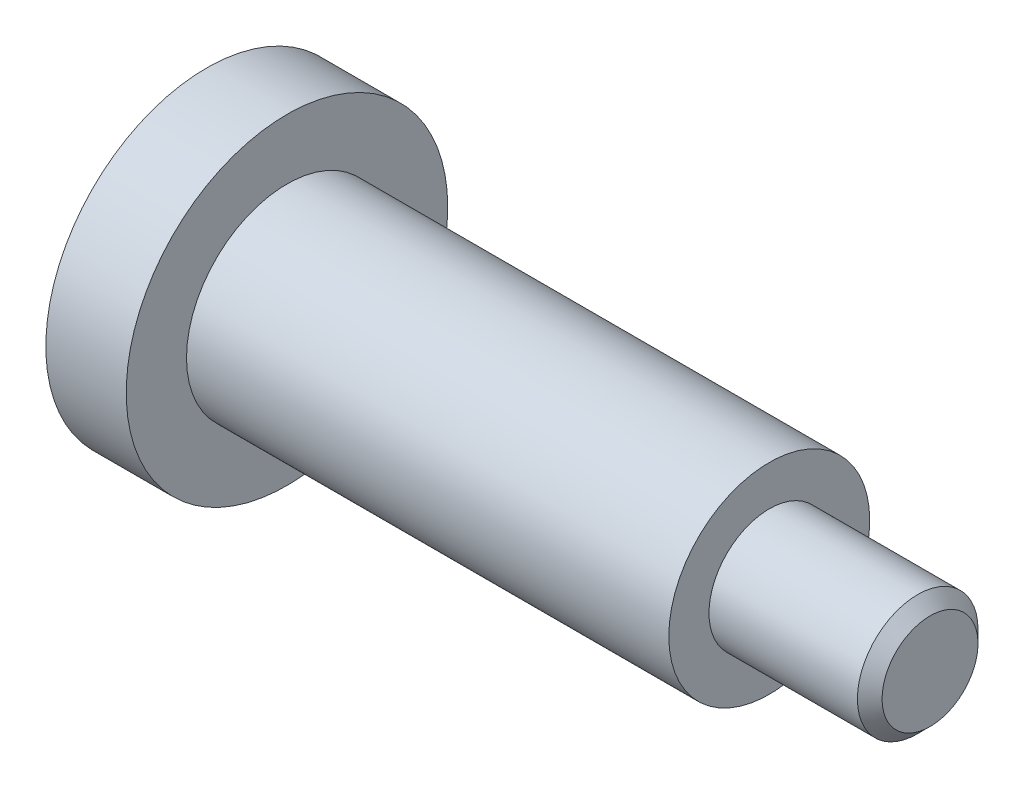
ISO-10303-21;
HEADER;
FILE_DESCRIPTION(('STEP AP214'),'2;1');
FILE_NAME('part.step','',(''),(''),'','','');
FILE_SCHEMA(('AUTOMOTIVE_DESIGN { 1 0 10303 214 1 1 1 1 }'));
ENDSEC;
DATA;
#1=APPLICATION_CONTEXT('core data for automotive mechanical design processes');
#2=APPLICATION_PROTOCOL_DEFINITION('international standard','automotive_design',2000,#1);
#3=PRODUCT_CONTEXT('',#1,'mechanical');
#4=PRODUCT('Part','Part','',(#3));
#5=PRODUCT_RELATED_PRODUCT_CATEGORY('part','',(#4));
#6=PRODUCT_DEFINITION_FORMATION('','',#4);
#7=PRODUCT_DEFINITION_CONTEXT('part definition',#1,'design');
#8=PRODUCT_DEFINITION('design','',#6,#7);
#9=PRODUCT_DEFINITION_SHAPE('','',#8);
#10=(LENGTH_UNIT() NAMED_UNIT(*) SI_UNIT(.MILLI.,.METRE.));
#11=(NAMED_UNIT(*) PLANE_ANGLE_UNIT() SI_UNIT($,.RADIAN.));
#12=(NAMED_UNIT(*) SI_UNIT($,.STERADIAN.) SOLID_ANGLE_UNIT());
#13=UNCERTAINTY_MEASURE_WITH_UNIT(LENGTH_MEASURE(1.E-05),#10,'distance_accuracy_value','');
#14=(GEOMETRIC_REPRESENTATION_CONTEXT(3) GLOBAL_UNCERTAINTY_ASSIGNED_CONTEXT((#13)) GLOBAL_UNIT_ASSIGNED_CONTEXT((#10,
#11,#12)) REPRESENTATION_CONTEXT('',''));
#15=CARTESIAN_POINT('',(0.,0.,0.));
#16=DIRECTION('',(0.,0.,1.));
#17=DIRECTION('',(1.,0.,0.));
#18=AXIS2_PLACEMENT_3D('',#15,#16,#17);
#19=CARTESIAN_POINT('',(0.,0.,0.));
#20=DIRECTION('',(1.,0.,0.));
#21=DIRECTION('',(0.,0.,-1.));
#22=AXIS2_PLACEMENT_3D('',#19,#20,#21);
#23=PLANE('',#22);
#24=DIRECTION('',(0.,0.5,-0.866025403784439));
#25=VECTOR('',#24,1.);
#26=CARTESIAN_POINT('',(0.,-0.577350269189626,-1.));
#27=LINE('',#26,#25);
#28=CARTESIAN_POINT('',(-2.8421275749535E-11,-0.866025403798813,-0.500000000008299));
#29=VERTEX_POINT('',#28);
#30=CARTESIAN_POINT('',(0.,-1.15470053837925,0.));
#31=VERTEX_POINT('',#30);
#32=EDGE_CURVE('E133',#29,#31,#27,.F.);
#33=ORIENTED_EDGE('',*,*,#32,.T.);
#34=DIRECTION('',(0.,-0.5,-0.866025403784439));
#35=VECTOR('',#34,1.);
#36=CARTESIAN_POINT('',(0.,-1.15470053837925,0.));
#37=LINE('',#36,#35);
#38=CARTESIAN_POINT('',(-2.8421275749535E-11,-0.866025403798813,0.500000000008298));
#39=VERTEX_POINT('',#38);
#40=EDGE_CURVE('E138',#31,#39,#37,.F.);
#41=ORIENTED_EDGE('',*,*,#40,.T.);
#42=CARTESIAN_POINT('',(-5.6843418860808E-11,0.,0.));
#43=DIRECTION('',(-1.,0.,0.));
#44=DIRECTION('',(0.,0.,1.));
#45=AXIS2_PLACEMENT_3D('',#42,#43,#44);
#46=CIRCLE('',#45,1.0000000000332);
#47=EDGE_CURVE('E109',#39,#29,#46,.F.);
#48=ORIENTED_EDGE('',*,*,#47,.T.);
#49=EDGE_LOOP('',(#33,#41,#48));
#50=FACE_BOUND('',#49,.T.);
#51=ADVANCED_FACE('F16',(#50),#23,.F.);
#52=CARTESIAN_POINT('',(0.,0.,0.));
#53=DIRECTION('',(1.,0.,0.));
#54=DIRECTION('',(0.,0.,-1.));
#55=AXIS2_PLACEMENT_3D('',#52,#53,#54);
#56=PLANE('',#55);
#57=DIRECTION('',(0.,1.,0.));
#58=VECTOR('',#57,1.);
#59=CARTESIAN_POINT('',(0.,0.577350269189626,-1.));
#60=LINE('',#59,#58);
#61=CARTESIAN_POINT('',(-2.8421709430404E-11,0.,-1.0000000000166));
#62=VERTEX_POINT('',#61);
#63=CARTESIAN_POINT('',(0.,-0.577350269189626,-1.));
#64=VERTEX_POINT('',#63);
#65=EDGE_CURVE('E90',#62,#64,#60,.F.);
#66=ORIENTED_EDGE('',*,*,#65,.T.);
#67=DIRECTION('',(0.,0.5,-0.866025403784439));
#68=VECTOR('',#67,1.);
#69=CARTESIAN_POINT('',(0.,-0.577350269189626,-1.));
#70=LINE('',#69,#68);
#71=EDGE_CURVE('E92',#64,#29,#70,.F.);
#72=ORIENTED_EDGE('',*,*,#71,.T.);
#73=CARTESIAN_POINT('',(-5.6843418860808E-11,0.,0.));
#74=DIRECTION('',(-1.,0.,0.));
#75=DIRECTION('',(0.,0.,1.));
#76=AXIS2_PLACEMENT_3D('',#73,#74,#75);
#77=CIRCLE('',#76,1.0000000000332);
#78=EDGE_CURVE('E19',#29,#62,#77,.F.);
#79=ORIENTED_EDGE('',*,*,#78,.T.);
#80=EDGE_LOOP('',(#66,#72,#79));
#81=FACE_BOUND('',#80,.T.);
#82=ADVANCED_FACE('F88',(#81),#56,.F.);
#83=CARTESIAN_POINT('',(-2.,-0.577350269189626,-1.));
#84=DIRECTION('',(0.,-0.866025403784439,-0.5));
#85=DIRECTION('',(0.,0.5,-0.866025403784439));
#86=AXIS2_PLACEMENT_3D('',#83,#84,#85);
#87=PLANE('',#86);
#88=DIRECTION('',(1.,0.,0.));
#89=VECTOR('',#88,1.);
#90=CARTESIAN_POINT('',(-2.,-1.15470053837925,0.));
#91=LINE('',#90,#89);
#92=CARTESIAN_POINT('',(-2.,-1.15470053837925,0.));
#93=VERTEX_POINT('',#92);
#94=EDGE_CURVE('E141',#93,#31,#91,.T.);
#95=ORIENTED_EDGE('',*,*,#94,.T.);
#96=ORIENTED_EDGE('',*,*,#32,.F.);
#97=ORIENTED_EDGE('',*,*,#71,.F.);
#98=DIRECTION('',(-1.,0.,0.));
#99=VECTOR('',#98,1.);
#100=CARTESIAN_POINT('',(-2.,-0.577350269189626,-1.));
#101=LINE('',#100,#99);
#102=CARTESIAN_POINT('',(-2.,-0.577350269189626,-1.));
#103=VERTEX_POINT('',#102);
#104=EDGE_CURVE('E122',#64,#103,#101,.T.);
#105=ORIENTED_EDGE('',*,*,#104,.T.);
#106=DIRECTION('',(0.,0.5,-0.866025403784439));
#107=VECTOR('',#106,1.);
#108=CARTESIAN_POINT('',(-2.,-0.577350269189626,-1.));
#109=LINE('',#108,#107);
#110=EDGE_CURVE('E146',#93,#103,#109,.T.);
#111=ORIENTED_EDGE('',*,*,#110,.F.);
#112=EDGE_LOOP('',(#95,#96,#97,#105,#111));
#113=FACE_BOUND('',#112,.T.);
#114=ADVANCED_FACE('F398',(#113),#87,.F.);
#115=CARTESIAN_POINT('',(-2.,-1.15470053837925,0.));
#116=DIRECTION('',(0.,-0.866025403784439,0.5));
#117=DIRECTION('',(0.,-0.5,-0.866025403784439));
#118=AXIS2_PLACEMENT_3D('',#115,#116,#117);
#119=PLANE('',#118);
#120=DIRECTION('',(1.,0.,0.));
#121=VECTOR('',#120,1.);
#122=CARTESIAN_POINT('',(-2.,-0.577350269189626,1.));
#123=LINE('',#122,#121);
#124=CARTESIAN_POINT('',(-2.,-0.577350269189626,1.));
#125=VERTEX_POINT('',#124);
#126=CARTESIAN_POINT('',(0.,-0.577350269189626,1.));
#127=VERTEX_POINT('',#126);
#128=EDGE_CURVE('E156',#125,#127,#123,.T.);
#129=ORIENTED_EDGE('',*,*,#128,.T.);
#130=DIRECTION('',(0.,-0.5,-0.866025403784439));
#131=VECTOR('',#130,1.);
#132=CARTESIAN_POINT('',(0.,-0.577350269189626,1.));
#133=LINE('',#132,#131);
#134=EDGE_CURVE('E97',#127,#39,#133,.T.);
#135=ORIENTED_EDGE('',*,*,#134,.T.);
#136=ORIENTED_EDGE('',*,*,#40,.F.);
#137=ORIENTED_EDGE('',*,*,#94,.F.);
#138=DIRECTION('',(0.,-0.5,-0.866025403784439));
#139=VECTOR('',#138,1.);
#140=CARTESIAN_POINT('',(-2.,-1.15470053837925,0.));
#141=LINE('',#140,#139);
#142=EDGE_CURVE('E140',#125,#93,#141,.T.);
#143=ORIENTED_EDGE('',*,*,#142,.F.);
#144=EDGE_LOOP('',(#129,#135,#136,#137,#143));
#145=FACE_BOUND('',#144,.T.);
#146=ADVANCED_FACE('F196',(#145),#119,.F.);
#147=CARTESIAN_POINT('',(0.,0.,0.));
#148=DIRECTION('',(1.,0.,0.));
#149=DIRECTION('',(0.,0.,-1.));
#150=AXIS2_PLACEMENT_3D('',#147,#148,#149);
#151=PLANE('',#150);
#152=ORIENTED_EDGE('',*,*,#134,.F.);
#153=DIRECTION('',(0.,1.,0.));
#154=VECTOR('',#153,1.);
#155=CARTESIAN_POINT('',(0.,-0.577350269189626,1.));
#156=LINE('',#155,#154);
#157=CARTESIAN_POINT('',(-2.8421709430404E-11,0.,1.0000000000166));
#158=VERTEX_POINT('',#157);
#159=EDGE_CURVE('E189',#127,#158,#156,.T.);
#160=ORIENTED_EDGE('',*,*,#159,.T.);
#161=CARTESIAN_POINT('',(-5.6843418860808E-11,0.,0.));
#162=DIRECTION('',(-1.,0.,0.));
#163=DIRECTION('',(0.,0.,1.));
#164=AXIS2_PLACEMENT_3D('',#161,#162,#163);
#165=CIRCLE('',#164,1.0000000000332);
#166=EDGE_CURVE('E96',#158,#39,#165,.F.);
#167=ORIENTED_EDGE('',*,*,#166,.T.);
#168=EDGE_LOOP('',(#152,#160,#167));
#169=FACE_BOUND('',#168,.T.);
#170=ADVANCED_FACE('F186',(#169),#151,.F.);
#171=CARTESIAN_POINT('',(-5.6843418860808E-11,0.,0.));
#172=DIRECTION('',(-1.,0.,0.));
#173=DIRECTION('',(0.,0.,1.));
#174=AXIS2_PLACEMENT_3D('',#171,#172,#173);
#175=CONICAL_SURFACE('',#174,1.0000000000332,1.04719755109258);
#176=CARTESIAN_POINT('',(-5.6843418860808E-11,0.,0.));
#177=DIRECTION('',(-1.,0.,0.));
#178=DIRECTION('',(0.,0.,1.));
#179=AXIS2_PLACEMENT_3D('',#176,#177,#178);
#180=CIRCLE('',#179,1.0000000000332);
#181=CARTESIAN_POINT('',(-2.8421275749535E-11,0.866025403798813,0.500000000008299));
#182=VERTEX_POINT('',#181);
#183=CARTESIAN_POINT('',(-2.8421275749535E-11,0.866025403798813,-0.500000000008299));
#184=VERTEX_POINT('',#183);
#185=EDGE_CURVE('E104',#182,#184,#180,.T.);
#186=ORIENTED_EDGE('',*,*,#185,.T.);
#187=CARTESIAN_POINT('',(-5.6843418860808E-11,0.,0.));
#188=DIRECTION('',(-1.,0.,0.));
#189=DIRECTION('',(0.,0.,1.));
#190=AXIS2_PLACEMENT_3D('',#187,#188,#189);
#191=CIRCLE('',#190,1.0000000000332);
#192=EDGE_CURVE('E99',#184,#62,#191,.T.);
#193=ORIENTED_EDGE('',*,*,#192,.T.);
#194=ORIENTED_EDGE('',*,*,#78,.F.);
#195=ORIENTED_EDGE('',*,*,#47,.F.);
#196=ORIENTED_EDGE('',*,*,#166,.F.);
#197=CARTESIAN_POINT('',(-5.6843418860808E-11,0.,0.));
#198=DIRECTION('',(-1.,0.,0.));
#199=DIRECTION('',(0.,0.,1.));
#200=AXIS2_PLACEMENT_3D('',#197,#198,#199);
#201=CIRCLE('',#200,1.0000000000332);
#202=EDGE_CURVE('E178',#158,#182,#201,.T.);
#203=ORIENTED_EDGE('',*,*,#202,.T.);
#204=EDGE_LOOP('',(#186,#193,#194,#195,#196,#203));
#205=FACE_BOUND('',#204,.T.);
#206=CARTESIAN_POINT('',(0.577350269196586,2.8421709430404E-11,0.));
#207=VERTEX_POINT('',#206);
#208=VERTEX_LOOP('',#207);
#209=FACE_BOUND('',#208,.T.);
#210=ADVANCED_FACE('F101',(#205,#209),#175,.F.);
#211=CARTESIAN_POINT('',(0.,0.,0.));
#212=DIRECTION('',(1.,0.,0.));
#213=DIRECTION('',(0.,0.,-1.));
#214=AXIS2_PLACEMENT_3D('',#211,#212,#213);
#215=PLANE('',#214);
#216=DIRECTION('',(0.,0.5,0.866025403784439));
#217=VECTOR('',#216,1.);
#218=CARTESIAN_POINT('',(0.,1.15470053837925,0.));
#219=LINE('',#218,#217);
#220=CARTESIAN_POINT('',(0.,0.577350269189625,-1.));
#221=VERTEX_POINT('',#220);
#222=EDGE_CURVE('E113',#184,#221,#219,.F.);
#223=ORIENTED_EDGE('',*,*,#222,.T.);
#224=DIRECTION('',(0.,1.,0.));
#225=VECTOR('',#224,1.);
#226=CARTESIAN_POINT('',(0.,0.577350269189626,-1.));
#227=LINE('',#226,#225);
#228=EDGE_CURVE('E108',#221,#62,#227,.F.);
#229=ORIENTED_EDGE('',*,*,#228,.T.);
#230=ORIENTED_EDGE('',*,*,#192,.F.);
#231=EDGE_LOOP('',(#223,#229,#230));
#232=FACE_BOUND('',#231,.T.);
#233=ADVANCED_FACE('F112',(#232),#215,.F.);
#234=CARTESIAN_POINT('',(-2.,0.577350269189626,-1.));
#235=DIRECTION('',(0.,0.,-1.));
#236=DIRECTION('',(-1.,0.,0.));
#237=AXIS2_PLACEMENT_3D('',#234,#235,#236);
#238=PLANE('',#237);
#239=ORIENTED_EDGE('',*,*,#104,.F.);
#240=ORIENTED_EDGE('',*,*,#65,.F.);
#241=ORIENTED_EDGE('',*,*,#228,.F.);
#242=DIRECTION('',(1.,0.,0.));
#243=VECTOR('',#242,1.);
#244=CARTESIAN_POINT('',(-2.,0.577350269189625,-1.));
#245=LINE('',#244,#243);
#246=CARTESIAN_POINT('',(-2.,0.577350269189626,-1.));
#247=VERTEX_POINT('',#246);
#248=EDGE_CURVE('E212',#221,#247,#245,.F.);
#249=ORIENTED_EDGE('',*,*,#248,.T.);
#250=DIRECTION('',(0.,1.,0.));
#251=VECTOR('',#250,1.);
#252=CARTESIAN_POINT('',(-2.,0.577350269189626,-1.));
#253=LINE('',#252,#251);
#254=EDGE_CURVE('E124',#103,#247,#253,.T.);
#255=ORIENTED_EDGE('',*,*,#254,.F.);
#256=EDGE_LOOP('',(#239,#240,#241,#249,#255));
#257=FACE_BOUND('',#256,.T.);
#258=ADVANCED_FACE('F119',(#257),#238,.F.);
#259=CARTESIAN_POINT('',(-2.,-0.577350269189626,1.));
#260=DIRECTION('',(0.,0.,1.));
#261=DIRECTION('',(1.,0.,0.));
#262=AXIS2_PLACEMENT_3D('',#259,#260,#261);
#263=PLANE('',#262);
#264=DIRECTION('',(1.,0.,0.));
#265=VECTOR('',#264,1.);
#266=CARTESIAN_POINT('',(-2.,0.577350269189626,1.));
#267=LINE('',#266,#265);
#268=CARTESIAN_POINT('',(-2.,0.577350269189626,1.));
#269=VERTEX_POINT('',#268);
#270=CARTESIAN_POINT('',(0.,0.577350269189626,1.));
#271=VERTEX_POINT('',#270);
#272=EDGE_CURVE('E228',#269,#271,#267,.T.);
#273=ORIENTED_EDGE('',*,*,#272,.T.);
#274=DIRECTION('',(0.,1.,0.));
#275=VECTOR('',#274,1.);
#276=CARTESIAN_POINT('',(0.,0.,1.));
#277=LINE('',#276,#275);
#278=EDGE_CURVE('E179',#271,#158,#277,.F.);
#279=ORIENTED_EDGE('',*,*,#278,.T.);
#280=ORIENTED_EDGE('',*,*,#159,.F.);
#281=ORIENTED_EDGE('',*,*,#128,.F.);
#282=DIRECTION('',(0.,1.,0.));
#283=VECTOR('',#282,1.);
#284=CARTESIAN_POINT('',(-2.,-0.577350269189626,1.));
#285=LINE('',#284,#283);
#286=EDGE_CURVE('E209',#269,#125,#285,.F.);
#287=ORIENTED_EDGE('',*,*,#286,.F.);
#288=EDGE_LOOP('',(#273,#279,#280,#281,#287));
#289=FACE_BOUND('',#288,.T.);
#290=ADVANCED_FACE('F359',(#289),#263,.F.);
#291=CARTESIAN_POINT('',(0.,0.,0.));
#292=DIRECTION('',(1.,0.,0.));
#293=DIRECTION('',(0.,0.,-1.));
#294=AXIS2_PLACEMENT_3D('',#291,#292,#293);
#295=PLANE('',#294);
#296=ORIENTED_EDGE('',*,*,#278,.F.);
#297=DIRECTION('',(0.,-0.5,0.866025403784439));
#298=VECTOR('',#297,1.);
#299=CARTESIAN_POINT('',(0.,0.577350269189626,1.));
#300=LINE('',#299,#298);
#301=EDGE_CURVE('E230',#271,#182,#300,.F.);
#302=ORIENTED_EDGE('',*,*,#301,.T.);
#303=ORIENTED_EDGE('',*,*,#202,.F.);
#304=EDGE_LOOP('',(#296,#302,#303));
#305=FACE_BOUND('',#304,.T.);
#306=ADVANCED_FACE('F351',(#305),#295,.F.);
#307=CARTESIAN_POINT('',(0.,0.,0.));
#308=DIRECTION('',(1.,0.,0.));
#309=DIRECTION('',(0.,0.,-1.));
#310=AXIS2_PLACEMENT_3D('',#307,#308,#309);
#311=PLANE('',#310);
#312=DIRECTION('',(0.,-0.5,0.866025403784439));
#313=VECTOR('',#312,1.);
#314=CARTESIAN_POINT('',(0.,0.577350269189626,1.));
#315=LINE('',#314,#313);
#316=CARTESIAN_POINT('',(0.,1.15470053837925,0.));
#317=VERTEX_POINT('',#316);
#318=EDGE_CURVE('E237',#182,#317,#315,.F.);
#319=ORIENTED_EDGE('',*,*,#318,.T.);
#320=DIRECTION('',(0.,0.5,0.866025403784439));
#321=VECTOR('',#320,1.);
#322=CARTESIAN_POINT('',(0.,1.15470053837925,0.));
#323=LINE('',#322,#321);
#324=EDGE_CURVE('E177',#317,#184,#323,.F.);
#325=ORIENTED_EDGE('',*,*,#324,.T.);
#326=ORIENTED_EDGE('',*,*,#185,.F.);
#327=EDGE_LOOP('',(#319,#325,#326));
#328=FACE_BOUND('',#327,.T.);
#329=ADVANCED_FACE('F273',(#328),#311,.F.);
#330=CARTESIAN_POINT('',(-2.,1.15470053837925,0.));
#331=DIRECTION('',(0.,0.866025403784439,-0.5));
#332=DIRECTION('',(0.,0.5,0.866025403784439));
#333=AXIS2_PLACEMENT_3D('',#330,#331,#332);
#334=PLANE('',#333);
#335=ORIENTED_EDGE('',*,*,#248,.F.);
#336=ORIENTED_EDGE('',*,*,#222,.F.);
#337=ORIENTED_EDGE('',*,*,#324,.F.);
#338=DIRECTION('',(1.,0.,0.));
#339=VECTOR('',#338,1.);
#340=CARTESIAN_POINT('',(-2.,1.15470053837925,0.));
#341=LINE('',#340,#339);
#342=CARTESIAN_POINT('',(-2.,1.15470053837925,0.));
#343=VERTEX_POINT('',#342);
#344=EDGE_CURVE('E175',#317,#343,#341,.F.);
#345=ORIENTED_EDGE('',*,*,#344,.T.);
#346=DIRECTION('',(0.,0.5,0.866025403784439));
#347=VECTOR('',#346,1.);
#348=CARTESIAN_POINT('',(-2.,1.15470053837925,0.));
#349=LINE('',#348,#347);
#350=EDGE_CURVE('E34',#247,#343,#349,.T.);
#351=ORIENTED_EDGE('',*,*,#350,.F.);
#352=EDGE_LOOP('',(#335,#336,#337,#345,#351));
#353=FACE_BOUND('',#352,.T.);
#354=ADVANCED_FACE('F264',(#353),#334,.F.);
#355=CARTESIAN_POINT('',(16.,0.59675,0.));
#356=DIRECTION('',(1.,0.,0.));
#357=DIRECTION('',(0.,0.,-1.));
#358=AXIS2_PLACEMENT_3D('',#355,#356,#357);
#359=PLANE('',#358);
#360=CARTESIAN_POINT('',(15.9999999999627,0.,0.));
#361=DIRECTION('',(-1.,0.,0.));
#362=DIRECTION('',(0.,0.,1.));
#363=AXIS2_PLACEMENT_3D('',#360,#361,#362);
#364=CIRCLE('',#363,1.19349999994256);
#365=CARTESIAN_POINT('',(15.9999999999627,0.,1.19349999994256));
#366=VERTEX_POINT('',#365);
#367=EDGE_CURVE('E171',#366,#366,#364,.T.);
#368=ORIENTED_EDGE('',*,*,#367,.F.);
#369=EDGE_LOOP('',(#368));
#370=FACE_BOUND('',#369,.T.);
#371=ADVANCED_FACE('F262',(#370),#359,.T.);
#372=CARTESIAN_POINT('',(-2.,0.577350269189626,1.));
#373=DIRECTION('',(0.,0.866025403784439,0.5));
#374=DIRECTION('',(0.,-0.5,0.866025403784439));
#375=AXIS2_PLACEMENT_3D('',#372,#373,#374);
#376=PLANE('',#375);
#377=ORIENTED_EDGE('',*,*,#344,.F.);
#378=ORIENTED_EDGE('',*,*,#318,.F.);
#379=ORIENTED_EDGE('',*,*,#301,.F.);
#380=ORIENTED_EDGE('',*,*,#272,.F.);
#381=DIRECTION('',(0.,-0.499999999999999,0.866025403784439));
#382=VECTOR('',#381,1.);
#383=CARTESIAN_POINT('',(-2.,1.15470053837925,0.));
#384=LINE('',#383,#382);
#385=EDGE_CURVE('E174',#343,#269,#384,.T.);
#386=ORIENTED_EDGE('',*,*,#385,.F.);
#387=EDGE_LOOP('',(#377,#378,#379,#380,#386));
#388=FACE_BOUND('',#387,.T.);
#389=ADVANCED_FACE('F258',(#388),#376,.F.);
#390=CARTESIAN_POINT('',(15.6934999998839,0.,0.));
#391=DIRECTION('',(-1.,0.,0.));
#392=DIRECTION('',(0.,0.,1.));
#393=AXIS2_PLACEMENT_3D('',#390,#391,#392);
#394=CONICAL_SURFACE('',#393,1.50000000002137,0.785398163397448);
#395=CARTESIAN_POINT('',(15.6935,0.,0.));
#396=DIRECTION('',(1.,0.,0.));
#397=DIRECTION('',(0.,0.,-1.));
#398=AXIS2_PLACEMENT_3D('',#395,#396,#397);
#399=CIRCLE('',#398,1.5);
#400=CARTESIAN_POINT('',(15.6935,0.,-1.5));
#401=VERTEX_POINT('',#400);
#402=EDGE_CURVE('E170',#401,#401,#399,.F.);
#403=ORIENTED_EDGE('',*,*,#402,.F.);
#404=EDGE_LOOP('',(#403));
#405=FACE_BOUND('',#404,.T.);
#406=ORIENTED_EDGE('',*,*,#367,.T.);
#407=EDGE_LOOP('',(#406));
#408=FACE_BOUND('',#407,.T.);
#409=ADVANCED_FACE('F254',(#405,#408),#394,.T.);
#410=CARTESIAN_POINT('',(-2.,2.,0.));
#411=DIRECTION('',(-1.,0.,0.));
#412=DIRECTION('',(0.,0.,1.));
#413=AXIS2_PLACEMENT_3D('',#410,#411,#412);
#414=PLANE('',#413);
#415=CARTESIAN_POINT('',(-2.,0.,0.));
#416=DIRECTION('',(1.,0.,0.));
#417=DIRECTION('',(0.,0.,-1.));
#418=AXIS2_PLACEMENT_3D('',#415,#416,#417);
#419=CIRCLE('',#418,4.);
#420=CARTESIAN_POINT('',(-2.,0.,-4.));
#421=VERTEX_POINT('',#420);
#422=EDGE_CURVE('E167',#421,#421,#419,.T.);
#423=ORIENTED_EDGE('',*,*,#422,.F.);
#424=EDGE_LOOP('',(#423));
#425=FACE_BOUND('',#424,.T.);
#426=ORIENTED_EDGE('',*,*,#350,.T.);
#427=ORIENTED_EDGE('',*,*,#385,.T.);
#428=ORIENTED_EDGE('',*,*,#286,.T.);
#429=ORIENTED_EDGE('',*,*,#142,.T.);
#430=ORIENTED_EDGE('',*,*,#110,.T.);
#431=ORIENTED_EDGE('',*,*,#254,.T.);
#432=EDGE_LOOP('',(#426,#427,#428,#429,#430,#431));
#433=FACE_BOUND('',#432,.T.);
#434=ADVANCED_FACE('F257',(#425,#433),#414,.T.);
#435=CARTESIAN_POINT('',(13.84675,0.,0.));
#436=DIRECTION('',(1.,0.,0.));
#437=DIRECTION('',(0.,0.,-1.));
#438=AXIS2_PLACEMENT_3D('',#435,#436,#437);
#439=CYLINDRICAL_SURFACE('',#438,1.5);
#440=CARTESIAN_POINT('',(12.,0.,0.));
#441=DIRECTION('',(1.,0.,0.));
#442=DIRECTION('',(0.,0.,-1.));
#443=AXIS2_PLACEMENT_3D('',#440,#441,#442);
#444=CIRCLE('',#443,1.5);
#445=CARTESIAN_POINT('',(12.,0.,-1.5));
#446=VERTEX_POINT('',#445);
#447=EDGE_CURVE('E164',#446,#446,#444,.F.);
#448=ORIENTED_EDGE('',*,*,#447,.F.);
#449=EDGE_LOOP('',(#448));
#450=FACE_BOUND('',#449,.T.);
#451=ORIENTED_EDGE('',*,*,#402,.T.);
#452=EDGE_LOOP('',(#451));
#453=FACE_BOUND('',#452,.T.);
#454=ADVANCED_FACE('F252',(#450,#453),#439,.T.);
#455=CARTESIAN_POINT('',(-1.,0.,0.));
#456=DIRECTION('',(1.,0.,0.));
#457=DIRECTION('',(0.,0.,-1.));
#458=AXIS2_PLACEMENT_3D('',#455,#456,#457);
#459=CYLINDRICAL_SURFACE('',#458,4.);
#460=ORIENTED_EDGE('',*,*,#422,.T.);
#461=EDGE_LOOP('',(#460));
#462=FACE_BOUND('',#461,.T.);
#463=CARTESIAN_POINT('',(0.,0.,0.));
#464=DIRECTION('',(1.,0.,0.));
#465=DIRECTION('',(0.,0.,-1.));
#466=AXIS2_PLACEMENT_3D('',#463,#464,#465);
#467=CIRCLE('',#466,4.);
#468=CARTESIAN_POINT('',(0.,0.,-4.));
#469=VERTEX_POINT('',#468);
#470=EDGE_CURVE('E161',#469,#469,#467,.T.);
#471=ORIENTED_EDGE('',*,*,#470,.F.);
#472=EDGE_LOOP('',(#471));
#473=FACE_BOUND('',#472,.T.);
#474=ADVANCED_FACE('F291',(#462,#473),#459,.T.);
#475=CARTESIAN_POINT('',(12.,1.25,0.));
#476=DIRECTION('',(1.,0.,0.));
#477=DIRECTION('',(0.,0.,-1.));
#478=AXIS2_PLACEMENT_3D('',#475,#476,#477);
#479=PLANE('',#478);
#480=CARTESIAN_POINT('',(12.,0.,0.));
#481=DIRECTION('',(1.,0.,0.));
#482=DIRECTION('',(0.,0.,-1.));
#483=AXIS2_PLACEMENT_3D('',#480,#481,#482);
#484=CIRCLE('',#483,2.5);
#485=CARTESIAN_POINT('',(12.,0.,-2.5));
#486=VERTEX_POINT('',#485);
#487=EDGE_CURVE('E25',#486,#486,#484,.F.);
#488=ORIENTED_EDGE('',*,*,#487,.F.);
#489=EDGE_LOOP('',(#488));
#490=FACE_BOUND('',#489,.T.);
#491=ORIENTED_EDGE('',*,*,#447,.T.);
#492=EDGE_LOOP('',(#491));
#493=FACE_BOUND('',#492,.T.);
#494=ADVANCED_FACE('F284',(#490,#493),#479,.T.);
#495=CARTESIAN_POINT('',(0.,3.25,0.));
#496=DIRECTION('',(1.,0.,0.));
#497=DIRECTION('',(0.,0.,-1.));
#498=AXIS2_PLACEMENT_3D('',#495,#496,#497);
#499=PLANE('',#498);
#500=CARTESIAN_POINT('',(0.,0.,0.));
#501=DIRECTION('',(1.,0.,0.));
#502=DIRECTION('',(0.,0.,-1.));
#503=AXIS2_PLACEMENT_3D('',#500,#501,#502);
#504=CIRCLE('',#503,2.5);
#505=CARTESIAN_POINT('',(0.,0.,-2.5));
#506=VERTEX_POINT('',#505);
#507=EDGE_CURVE('E10',#506,#506,#504,.T.);
#508=ORIENTED_EDGE('',*,*,#507,.F.);
#509=EDGE_LOOP('',(#508));
#510=FACE_BOUND('',#509,.T.);
#511=ORIENTED_EDGE('',*,*,#470,.T.);
#512=EDGE_LOOP('',(#511));
#513=FACE_BOUND('',#512,.T.);
#514=ADVANCED_FACE('F278',(#510,#513),#499,.T.);
#515=CARTESIAN_POINT('',(6.,0.,0.));
#516=DIRECTION('',(1.,0.,0.));
#517=DIRECTION('',(0.,0.,-1.));
#518=AXIS2_PLACEMENT_3D('',#515,#516,#517);
#519=CYLINDRICAL_SURFACE('',#518,2.5);
#520=ORIENTED_EDGE('',*,*,#487,.T.);
#521=EDGE_LOOP('',(#520));
#522=FACE_BOUND('',#521,.T.);
#523=ORIENTED_EDGE('',*,*,#507,.T.);
#524=EDGE_LOOP('',(#523));
#525=FACE_BOUND('',#524,.T.);
#526=ADVANCED_FACE('F276',(#522,#525),#519,.T.);
#527=CLOSED_SHELL('',(#51,#82,#114,#146,#170,#210,#233,#258,#290,#306,#329,#354,#371,#389,#409,
#434,#454,#474,#494,#514,#526));
#528=MANIFOLD_SOLID_BREP('B1',#527);
#529=ADVANCED_BREP_SHAPE_REPRESENTATION('',(#18,#528),#14);
#530=SHAPE_DEFINITION_REPRESENTATION(#9,#529);
ENDSEC;
END-ISO-10303-21;
